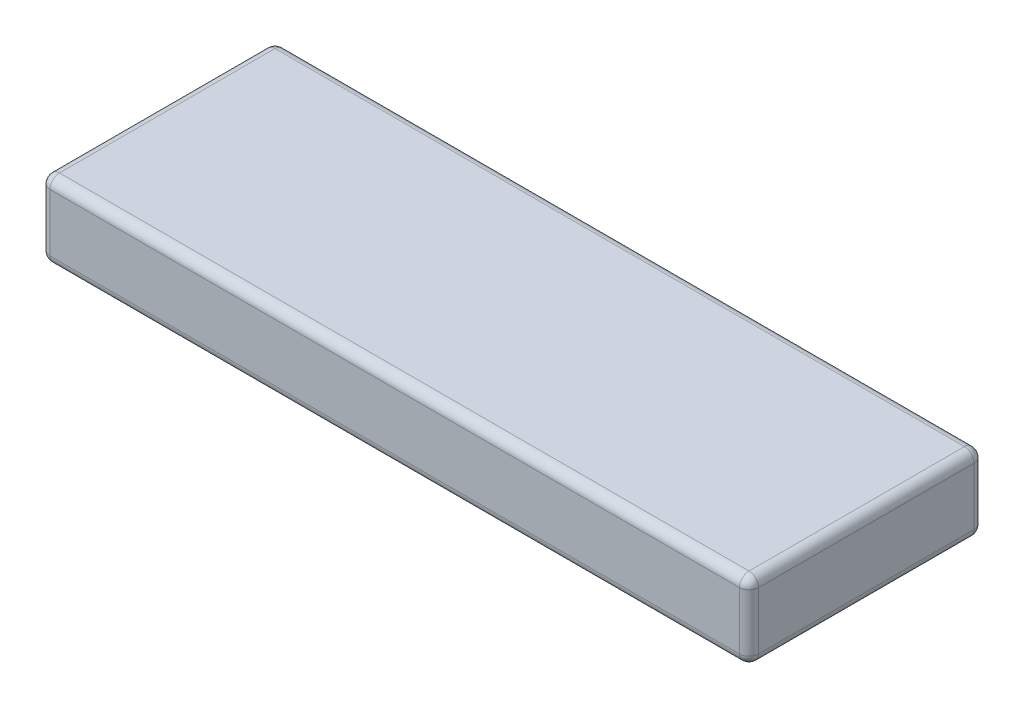
ISO-10303-21;
HEADER;
FILE_DESCRIPTION(('STEP AP214'),'2;1');
FILE_NAME('part.step','',(''),(''),'','','');
FILE_SCHEMA(('AUTOMOTIVE_DESIGN { 1 0 10303 214 1 1 1 1 }'));
ENDSEC;
DATA;
#1=APPLICATION_CONTEXT('core data for automotive mechanical design processes');
#2=APPLICATION_PROTOCOL_DEFINITION('international standard','automotive_design',2000,#1);
#3=PRODUCT_CONTEXT('',#1,'mechanical');
#4=PRODUCT('Part','Part','',(#3));
#5=PRODUCT_RELATED_PRODUCT_CATEGORY('part','',(#4));
#6=PRODUCT_DEFINITION_FORMATION('','',#4);
#7=PRODUCT_DEFINITION_CONTEXT('part definition',#1,'design');
#8=PRODUCT_DEFINITION('design','',#6,#7);
#9=PRODUCT_DEFINITION_SHAPE('','',#8);
#10=(LENGTH_UNIT() NAMED_UNIT(*) SI_UNIT(.MILLI.,.METRE.));
#11=(NAMED_UNIT(*) PLANE_ANGLE_UNIT() SI_UNIT($,.RADIAN.));
#12=(NAMED_UNIT(*) SI_UNIT($,.STERADIAN.) SOLID_ANGLE_UNIT());
#13=UNCERTAINTY_MEASURE_WITH_UNIT(LENGTH_MEASURE(1.E-05),#10,'distance_accuracy_value','');
#14=(GEOMETRIC_REPRESENTATION_CONTEXT(3) GLOBAL_UNCERTAINTY_ASSIGNED_CONTEXT((#13)) GLOBAL_UNIT_ASSIGNED_CONTEXT((#10,
#11,#12)) REPRESENTATION_CONTEXT('',''));
#15=CARTESIAN_POINT('',(0.,0.,0.));
#16=DIRECTION('',(0.,0.,1.));
#17=DIRECTION('',(1.,0.,0.));
#18=AXIS2_PLACEMENT_3D('',#15,#16,#17);
#19=CARTESIAN_POINT('',(-85.9648283794992,16.,-49.));
#20=DIRECTION('',(1.,0.,0.));
#21=DIRECTION('',(0.,0.,-1.));
#22=AXIS2_PLACEMENT_3D('',#19,#20,#21);
#23=PLANE('',#22);
#24=DIRECTION('',(0.,0.,1.));
#25=VECTOR('',#24,1.);
#26=CARTESIAN_POINT('',(-85.9648283794992,2.,-49.));
#27=LINE('',#26,#25);
#28=CARTESIAN_POINT('',(-85.9648283794992,2.,-47.));
#29=VERTEX_POINT('',#28);
#30=CARTESIAN_POINT('',(-85.9648283794992,2.,-2.));
#31=VERTEX_POINT('',#30);
#32=EDGE_CURVE('E282',#29,#31,#27,.T.);
#33=ORIENTED_EDGE('',*,*,#32,.T.);
#34=DIRECTION('',(0.,-1.,0.));
#35=VECTOR('',#34,1.);
#36=CARTESIAN_POINT('',(-85.9648283794992,16.,-2.));
#37=LINE('',#36,#35);
#38=CARTESIAN_POINT('',(-85.9648283794992,14.,-2.));
#39=VERTEX_POINT('',#38);
#40=EDGE_CURVE('E211',#31,#39,#37,.F.);
#41=ORIENTED_EDGE('',*,*,#40,.T.);
#42=DIRECTION('',(0.,0.,1.));
#43=VECTOR('',#42,1.);
#44=CARTESIAN_POINT('',(-85.9648283794992,14.,-49.));
#45=LINE('',#44,#43);
#46=CARTESIAN_POINT('',(-85.9648283794992,14.,-47.));
#47=VERTEX_POINT('',#46);
#48=EDGE_CURVE('E275',#39,#47,#45,.F.);
#49=ORIENTED_EDGE('',*,*,#48,.T.);
#50=DIRECTION('',(0.,-1.,0.));
#51=VECTOR('',#50,1.);
#52=CARTESIAN_POINT('',(-85.9648283794992,16.,-47.));
#53=LINE('',#52,#51);
#54=EDGE_CURVE('E277',#47,#29,#53,.T.);
#55=ORIENTED_EDGE('',*,*,#54,.T.);
#56=EDGE_LOOP('',(#33,#41,#49,#55));
#57=FACE_BOUND('',#56,.T.);
#58=ADVANCED_FACE('F33',(#57),#23,.F.);
#59=CARTESIAN_POINT('',(-85.9648283794992,16.,0.));
#60=DIRECTION('',(0.,0.,-1.));
#61=DIRECTION('',(-1.,0.,0.));
#62=AXIS2_PLACEMENT_3D('',#59,#60,#61);
#63=PLANE('',#62);
#64=DIRECTION('',(0.,-1.,0.));
#65=VECTOR('',#64,1.);
#66=CARTESIAN_POINT('',(-83.9648283794992,16.,0.));
#67=LINE('',#66,#65);
#68=CARTESIAN_POINT('',(-83.9648283794992,14.,0.));
#69=VERTEX_POINT('',#68);
#70=CARTESIAN_POINT('',(-83.9648283794992,2.,0.));
#71=VERTEX_POINT('',#70);
#72=EDGE_CURVE('E134',#69,#71,#67,.T.);
#73=ORIENTED_EDGE('',*,*,#72,.T.);
#74=DIRECTION('',(1.,0.,0.));
#75=VECTOR('',#74,1.);
#76=CARTESIAN_POINT('',(-85.9648283794992,2.,0.));
#77=LINE('',#76,#75);
#78=CARTESIAN_POINT('',(60.0351716205008,2.,0.));
#79=VERTEX_POINT('',#78);
#80=EDGE_CURVE('E130',#71,#79,#77,.T.);
#81=ORIENTED_EDGE('',*,*,#80,.T.);
#82=DIRECTION('',(0.,-1.,0.));
#83=VECTOR('',#82,1.);
#84=CARTESIAN_POINT('',(60.0351716205008,16.,0.));
#85=LINE('',#84,#83);
#86=CARTESIAN_POINT('',(60.0351716205008,14.,0.));
#87=VERTEX_POINT('',#86);
#88=EDGE_CURVE('E124',#79,#87,#85,.F.);
#89=ORIENTED_EDGE('',*,*,#88,.T.);
#90=DIRECTION('',(1.,0.,0.));
#91=VECTOR('',#90,1.);
#92=CARTESIAN_POINT('',(-85.9648283794992,14.,0.));
#93=LINE('',#92,#91);
#94=EDGE_CURVE('E127',#87,#69,#93,.F.);
#95=ORIENTED_EDGE('',*,*,#94,.T.);
#96=EDGE_LOOP('',(#73,#81,#89,#95));
#97=FACE_BOUND('',#96,.T.);
#98=ADVANCED_FACE('F126',(#97),#63,.F.);
#99=CARTESIAN_POINT('',(62.0351716205008,16.,0.));
#100=DIRECTION('',(-1.,0.,0.));
#101=DIRECTION('',(0.,0.,1.));
#102=AXIS2_PLACEMENT_3D('',#99,#100,#101);
#103=PLANE('',#102);
#104=DIRECTION('',(0.,0.,-1.));
#105=VECTOR('',#104,1.);
#106=CARTESIAN_POINT('',(62.0351716205008,2.,0.));
#107=LINE('',#106,#105);
#108=CARTESIAN_POINT('',(62.0351716205008,2.,-2.));
#109=VERTEX_POINT('',#108);
#110=CARTESIAN_POINT('',(62.0351716205008,2.,-47.));
#111=VERTEX_POINT('',#110);
#112=EDGE_CURVE('E228',#109,#111,#107,.T.);
#113=ORIENTED_EDGE('',*,*,#112,.T.);
#114=DIRECTION('',(0.,-1.,0.));
#115=VECTOR('',#114,1.);
#116=CARTESIAN_POINT('',(62.0351716205008,16.,-47.));
#117=LINE('',#116,#115);
#118=CARTESIAN_POINT('',(62.0351716205008,14.,-47.));
#119=VERTEX_POINT('',#118);
#120=EDGE_CURVE('E230',#111,#119,#117,.F.);
#121=ORIENTED_EDGE('',*,*,#120,.T.);
#122=DIRECTION('',(0.,0.,-1.));
#123=VECTOR('',#122,1.);
#124=CARTESIAN_POINT('',(62.0351716205008,14.,0.));
#125=LINE('',#124,#123);
#126=CARTESIAN_POINT('',(62.0351716205008,14.,-2.));
#127=VERTEX_POINT('',#126);
#128=EDGE_CURVE('E221',#119,#127,#125,.F.);
#129=ORIENTED_EDGE('',*,*,#128,.T.);
#130=DIRECTION('',(0.,-1.,0.));
#131=VECTOR('',#130,1.);
#132=CARTESIAN_POINT('',(62.0351716205008,16.,-2.));
#133=LINE('',#132,#131);
#134=EDGE_CURVE('E156',#127,#109,#133,.T.);
#135=ORIENTED_EDGE('',*,*,#134,.T.);
#136=EDGE_LOOP('',(#113,#121,#129,#135));
#137=FACE_BOUND('',#136,.T.);
#138=ADVANCED_FACE('F326',(#137),#103,.F.);
#139=CARTESIAN_POINT('',(62.0351716205008,16.,-49.));
#140=DIRECTION('',(0.,0.,1.));
#141=DIRECTION('',(1.,0.,0.));
#142=AXIS2_PLACEMENT_3D('',#139,#140,#141);
#143=PLANE('',#142);
#144=DIRECTION('',(-1.,0.,0.));
#145=VECTOR('',#144,1.);
#146=CARTESIAN_POINT('',(62.0351716205008,2.,-49.));
#147=LINE('',#146,#145);
#148=CARTESIAN_POINT('',(60.0351716205008,2.,-49.));
#149=VERTEX_POINT('',#148);
#150=CARTESIAN_POINT('',(-83.9648283794992,2.,-49.));
#151=VERTEX_POINT('',#150);
#152=EDGE_CURVE('E217',#149,#151,#147,.T.);
#153=ORIENTED_EDGE('',*,*,#152,.T.);
#154=DIRECTION('',(0.,-1.,0.));
#155=VECTOR('',#154,1.);
#156=CARTESIAN_POINT('',(-83.9648283794992,16.,-49.));
#157=LINE('',#156,#155);
#158=CARTESIAN_POINT('',(-83.9648283794992,14.,-49.));
#159=VERTEX_POINT('',#158);
#160=EDGE_CURVE('E214',#151,#159,#157,.F.);
#161=ORIENTED_EDGE('',*,*,#160,.T.);
#162=DIRECTION('',(-1.,0.,0.));
#163=VECTOR('',#162,1.);
#164=CARTESIAN_POINT('',(62.0351716205008,14.,-49.));
#165=LINE('',#164,#163);
#166=CARTESIAN_POINT('',(60.0351716205008,14.,-49.));
#167=VERTEX_POINT('',#166);
#168=EDGE_CURVE('E207',#159,#167,#165,.F.);
#169=ORIENTED_EDGE('',*,*,#168,.T.);
#170=DIRECTION('',(0.,-1.,0.));
#171=VECTOR('',#170,1.);
#172=CARTESIAN_POINT('',(60.0351716205008,16.,-49.));
#173=LINE('',#172,#171);
#174=EDGE_CURVE('E210',#167,#149,#173,.T.);
#175=ORIENTED_EDGE('',*,*,#174,.T.);
#176=EDGE_LOOP('',(#153,#161,#169,#175));
#177=FACE_BOUND('',#176,.T.);
#178=ADVANCED_FACE('F215',(#177),#143,.F.);
#179=CARTESIAN_POINT('',(-85.9648283794992,16.,0.));
#180=DIRECTION('',(0.,1.,0.));
#181=DIRECTION('',(0.,0.,1.));
#182=AXIS2_PLACEMENT_3D('',#179,#180,#181);
#183=PLANE('',#182);
#184=DIRECTION('',(1.,0.,0.));
#185=VECTOR('',#184,1.);
#186=CARTESIAN_POINT('',(62.0351716205008,16.,-2.));
#187=LINE('',#186,#185);
#188=CARTESIAN_POINT('',(-83.9648283794992,16.,-2.));
#189=VERTEX_POINT('',#188);
#190=CARTESIAN_POINT('',(60.0351716205008,16.,-2.));
#191=VERTEX_POINT('',#190);
#192=EDGE_CURVE('E233',#189,#191,#187,.T.);
#193=ORIENTED_EDGE('',*,*,#192,.T.);
#194=DIRECTION('',(0.,0.,-1.));
#195=VECTOR('',#194,1.);
#196=CARTESIAN_POINT('',(60.0351716205008,16.,-49.));
#197=LINE('',#196,#195);
#198=CARTESIAN_POINT('',(60.0351716205008,16.,-47.));
#199=VERTEX_POINT('',#198);
#200=EDGE_CURVE('E11',#191,#199,#197,.T.);
#201=ORIENTED_EDGE('',*,*,#200,.T.);
#202=DIRECTION('',(-1.,0.,0.));
#203=VECTOR('',#202,1.);
#204=CARTESIAN_POINT('',(-85.9648283794992,16.,-47.));
#205=LINE('',#204,#203);
#206=CARTESIAN_POINT('',(-83.9648283794992,16.,-47.));
#207=VERTEX_POINT('',#206);
#208=EDGE_CURVE('E42',#199,#207,#205,.T.);
#209=ORIENTED_EDGE('',*,*,#208,.T.);
#210=DIRECTION('',(0.,0.,1.));
#211=VECTOR('',#210,1.);
#212=CARTESIAN_POINT('',(-83.9648283794992,16.,0.));
#213=LINE('',#212,#211);
#214=EDGE_CURVE('E235',#207,#189,#213,.T.);
#215=ORIENTED_EDGE('',*,*,#214,.T.);
#216=EDGE_LOOP('',(#193,#201,#209,#215));
#217=FACE_BOUND('',#216,.T.);
#218=ADVANCED_FACE('F483',(#217),#183,.T.);
#219=CARTESIAN_POINT('',(-85.9648283794992,0.,0.));
#220=DIRECTION('',(0.,1.,0.));
#221=DIRECTION('',(0.,0.,1.));
#222=AXIS2_PLACEMENT_3D('',#219,#220,#221);
#223=PLANE('',#222);
#224=DIRECTION('',(0.,0.,-1.));
#225=VECTOR('',#224,1.);
#226=CARTESIAN_POINT('',(60.0351716205008,0.,0.));
#227=LINE('',#226,#225);
#228=CARTESIAN_POINT('',(60.0351716205008,0.,-47.));
#229=VERTEX_POINT('',#228);
#230=CARTESIAN_POINT('',(60.0351716205008,0.,-2.));
#231=VERTEX_POINT('',#230);
#232=EDGE_CURVE('E271',#229,#231,#227,.F.);
#233=ORIENTED_EDGE('',*,*,#232,.T.);
#234=DIRECTION('',(1.,0.,0.));
#235=VECTOR('',#234,1.);
#236=CARTESIAN_POINT('',(-85.9648283794992,0.,-2.));
#237=LINE('',#236,#235);
#238=CARTESIAN_POINT('',(-83.9648283794992,0.,-2.));
#239=VERTEX_POINT('',#238);
#240=EDGE_CURVE('E265',#231,#239,#237,.F.);
#241=ORIENTED_EDGE('',*,*,#240,.T.);
#242=DIRECTION('',(0.,0.,1.));
#243=VECTOR('',#242,1.);
#244=CARTESIAN_POINT('',(-83.9648283794992,0.,0.));
#245=LINE('',#244,#243);
#246=CARTESIAN_POINT('',(-83.9648283794992,0.,-47.));
#247=VERTEX_POINT('',#246);
#248=EDGE_CURVE('E259',#239,#247,#245,.F.);
#249=ORIENTED_EDGE('',*,*,#248,.T.);
#250=DIRECTION('',(-1.,0.,0.));
#251=VECTOR('',#250,1.);
#252=CARTESIAN_POINT('',(-85.9648283794992,0.,-47.));
#253=LINE('',#252,#251);
#254=EDGE_CURVE('E266',#247,#229,#253,.F.);
#255=ORIENTED_EDGE('',*,*,#254,.T.);
#256=EDGE_LOOP('',(#233,#241,#249,#255));
#257=FACE_BOUND('',#256,.T.);
#258=ADVANCED_FACE('F269',(#257),#223,.F.);
#259=CARTESIAN_POINT('',(-85.9648283794992,14.,-47.));
#260=DIRECTION('',(1.,0.,0.));
#261=DIRECTION('',(0.,0.,-1.));
#262=AXIS2_PLACEMENT_3D('',#259,#260,#261);
#263=CYLINDRICAL_SURFACE('',#262,2.);
#264=CARTESIAN_POINT('',(-83.9648283794992,14.,-47.));
#265=DIRECTION('',(-1.,0.,0.));
#266=DIRECTION('',(0.,0.,1.));
#267=AXIS2_PLACEMENT_3D('',#264,#265,#266);
#268=CIRCLE('',#267,2.);
#269=EDGE_CURVE('E37',#207,#159,#268,.T.);
#270=ORIENTED_EDGE('',*,*,#269,.F.);
#271=ORIENTED_EDGE('',*,*,#208,.F.);
#272=CARTESIAN_POINT('',(60.0351716205008,14.,-47.));
#273=DIRECTION('',(1.,0.,0.));
#274=DIRECTION('',(0.,0.,-1.));
#275=AXIS2_PLACEMENT_3D('',#272,#273,#274);
#276=CIRCLE('',#275,2.);
#277=EDGE_CURVE('E194',#167,#199,#276,.T.);
#278=ORIENTED_EDGE('',*,*,#277,.F.);
#279=ORIENTED_EDGE('',*,*,#168,.F.);
#280=EDGE_LOOP('',(#270,#271,#278,#279));
#281=FACE_BOUND('',#280,.T.);
#282=ADVANCED_FACE('F35',(#281),#263,.T.);
#283=CARTESIAN_POINT('',(-83.9648283794992,14.,-47.));
#284=DIRECTION('',(0.,0.,1.));
#285=DIRECTION('',(1.,0.,0.));
#286=AXIS2_PLACEMENT_3D('',#283,#284,#285);
#287=SPHERICAL_SURFACE('',#286,2.);
#288=CARTESIAN_POINT('',(-83.9648283794992,14.,-47.));
#289=DIRECTION('',(0.,0.,-1.));
#290=DIRECTION('',(-1.,0.,0.));
#291=AXIS2_PLACEMENT_3D('',#288,#289,#290);
#292=CIRCLE('',#291,2.);
#293=EDGE_CURVE('E190',#207,#47,#292,.F.);
#294=ORIENTED_EDGE('',*,*,#293,.F.);
#295=ORIENTED_EDGE('',*,*,#269,.T.);
#296=CARTESIAN_POINT('',(-83.9648283794992,14.,-47.));
#297=DIRECTION('',(0.,1.,0.));
#298=DIRECTION('',(0.,0.,1.));
#299=AXIS2_PLACEMENT_3D('',#296,#297,#298);
#300=CIRCLE('',#299,2.);
#301=EDGE_CURVE('E193',#47,#159,#300,.F.);
#302=ORIENTED_EDGE('',*,*,#301,.F.);
#303=EDGE_LOOP('',(#294,#295,#302));
#304=FACE_BOUND('',#303,.T.);
#305=ADVANCED_FACE('F203',(#304),#287,.T.);
#306=CARTESIAN_POINT('',(60.0351716205008,14.,-47.));
#307=DIRECTION('',(0.,0.,1.));
#308=DIRECTION('',(1.,0.,0.));
#309=AXIS2_PLACEMENT_3D('',#306,#307,#308);
#310=SPHERICAL_SURFACE('',#309,2.);
#311=CARTESIAN_POINT('',(60.0351716205008,14.,-47.));
#312=DIRECTION('',(0.,1.,0.));
#313=DIRECTION('',(0.,0.,1.));
#314=AXIS2_PLACEMENT_3D('',#311,#312,#313);
#315=CIRCLE('',#314,2.);
#316=EDGE_CURVE('E186',#167,#119,#315,.F.);
#317=ORIENTED_EDGE('',*,*,#316,.F.);
#318=ORIENTED_EDGE('',*,*,#277,.T.);
#319=CARTESIAN_POINT('',(60.0351716205008,14.,-47.));
#320=DIRECTION('',(0.,0.,-1.));
#321=DIRECTION('',(-1.,0.,0.));
#322=AXIS2_PLACEMENT_3D('',#319,#320,#321);
#323=CIRCLE('',#322,2.);
#324=EDGE_CURVE('E50',#119,#199,#323,.F.);
#325=ORIENTED_EDGE('',*,*,#324,.F.);
#326=EDGE_LOOP('',(#317,#318,#325));
#327=FACE_BOUND('',#326,.T.);
#328=ADVANCED_FACE('F456',(#327),#310,.T.);
#329=CARTESIAN_POINT('',(-83.9648283794992,16.,-47.));
#330=DIRECTION('',(0.,-1.,0.));
#331=DIRECTION('',(0.,0.,-1.));
#332=AXIS2_PLACEMENT_3D('',#329,#330,#331);
#333=CYLINDRICAL_SURFACE('',#332,2.);
#334=ORIENTED_EDGE('',*,*,#301,.T.);
#335=ORIENTED_EDGE('',*,*,#160,.F.);
#336=CARTESIAN_POINT('',(-83.9648283794992,2.,-47.));
#337=DIRECTION('',(0.,-1.,0.));
#338=DIRECTION('',(0.,0.,-1.));
#339=AXIS2_PLACEMENT_3D('',#336,#337,#338);
#340=CIRCLE('',#339,2.);
#341=EDGE_CURVE('E180',#29,#151,#340,.T.);
#342=ORIENTED_EDGE('',*,*,#341,.F.);
#343=ORIENTED_EDGE('',*,*,#54,.F.);
#344=EDGE_LOOP('',(#334,#335,#342,#343));
#345=FACE_BOUND('',#344,.T.);
#346=ADVANCED_FACE('F308',(#345),#333,.T.);
#347=CARTESIAN_POINT('',(-83.9648283794992,14.,0.));
#348=DIRECTION('',(0.,0.,-1.));
#349=DIRECTION('',(-1.,0.,0.));
#350=AXIS2_PLACEMENT_3D('',#347,#348,#349);
#351=CYLINDRICAL_SURFACE('',#350,2.);
#352=ORIENTED_EDGE('',*,*,#293,.T.);
#353=ORIENTED_EDGE('',*,*,#48,.F.);
#354=CARTESIAN_POINT('',(-83.9648283794992,14.,-2.));
#355=DIRECTION('',(0.,0.,1.));
#356=DIRECTION('',(1.,0.,0.));
#357=AXIS2_PLACEMENT_3D('',#354,#355,#356);
#358=CIRCLE('',#357,2.);
#359=EDGE_CURVE('E177',#189,#39,#358,.T.);
#360=ORIENTED_EDGE('',*,*,#359,.F.);
#361=ORIENTED_EDGE('',*,*,#214,.F.);
#362=EDGE_LOOP('',(#352,#353,#360,#361));
#363=FACE_BOUND('',#362,.T.);
#364=ADVANCED_FACE('F440',(#363),#351,.T.);
#365=CARTESIAN_POINT('',(-85.9648283794992,14.,-2.));
#366=DIRECTION('',(-1.,0.,0.));
#367=DIRECTION('',(0.,0.,1.));
#368=AXIS2_PLACEMENT_3D('',#365,#366,#367);
#369=CYLINDRICAL_SURFACE('',#368,2.);
#370=CARTESIAN_POINT('',(60.0351716205008,14.,-2.));
#371=DIRECTION('',(1.,0.,0.));
#372=DIRECTION('',(0.,0.,-1.));
#373=AXIS2_PLACEMENT_3D('',#370,#371,#372);
#374=CIRCLE('',#373,2.);
#375=EDGE_CURVE('E141',#191,#87,#374,.T.);
#376=ORIENTED_EDGE('',*,*,#375,.F.);
#377=ORIENTED_EDGE('',*,*,#192,.F.);
#378=CARTESIAN_POINT('',(-83.9648283794992,14.,-2.));
#379=DIRECTION('',(-1.,0.,0.));
#380=DIRECTION('',(0.,0.,1.));
#381=AXIS2_PLACEMENT_3D('',#378,#379,#380);
#382=CIRCLE('',#381,2.);
#383=EDGE_CURVE('E144',#69,#189,#382,.T.);
#384=ORIENTED_EDGE('',*,*,#383,.F.);
#385=ORIENTED_EDGE('',*,*,#94,.F.);
#386=EDGE_LOOP('',(#376,#377,#384,#385));
#387=FACE_BOUND('',#386,.T.);
#388=ADVANCED_FACE('F139',(#387),#369,.T.);
#389=CARTESIAN_POINT('',(60.0351716205008,14.,0.));
#390=DIRECTION('',(0.,0.,1.));
#391=DIRECTION('',(1.,0.,0.));
#392=AXIS2_PLACEMENT_3D('',#389,#390,#391);
#393=CYLINDRICAL_SURFACE('',#392,2.);
#394=ORIENTED_EDGE('',*,*,#324,.T.);
#395=ORIENTED_EDGE('',*,*,#200,.F.);
#396=CARTESIAN_POINT('',(60.0351716205008,14.,-2.));
#397=DIRECTION('',(0.,0.,1.));
#398=DIRECTION('',(1.,0.,0.));
#399=AXIS2_PLACEMENT_3D('',#396,#397,#398);
#400=CIRCLE('',#399,2.);
#401=EDGE_CURVE('E153',#127,#191,#400,.T.);
#402=ORIENTED_EDGE('',*,*,#401,.F.);
#403=ORIENTED_EDGE('',*,*,#128,.F.);
#404=EDGE_LOOP('',(#394,#395,#402,#403));
#405=FACE_BOUND('',#404,.T.);
#406=ADVANCED_FACE('F425',(#405),#393,.T.);
#407=CARTESIAN_POINT('',(60.0351716205008,16.,-47.));
#408=DIRECTION('',(0.,-1.,0.));
#409=DIRECTION('',(0.,0.,-1.));
#410=AXIS2_PLACEMENT_3D('',#407,#408,#409);
#411=CYLINDRICAL_SURFACE('',#410,2.);
#412=ORIENTED_EDGE('',*,*,#316,.T.);
#413=ORIENTED_EDGE('',*,*,#120,.F.);
#414=CARTESIAN_POINT('',(60.0351716205008,2.,-47.));
#415=DIRECTION('',(0.,-1.,0.));
#416=DIRECTION('',(0.,0.,-1.));
#417=AXIS2_PLACEMENT_3D('',#414,#415,#416);
#418=CIRCLE('',#417,2.);
#419=EDGE_CURVE('E172',#149,#111,#418,.T.);
#420=ORIENTED_EDGE('',*,*,#419,.F.);
#421=ORIENTED_EDGE('',*,*,#174,.F.);
#422=EDGE_LOOP('',(#412,#413,#420,#421));
#423=FACE_BOUND('',#422,.T.);
#424=ADVANCED_FACE('F293',(#423),#411,.T.);
#425=CARTESIAN_POINT('',(62.0351716205008,2.,-47.));
#426=DIRECTION('',(-1.,0.,0.));
#427=DIRECTION('',(0.,0.,1.));
#428=AXIS2_PLACEMENT_3D('',#425,#426,#427);
#429=CYLINDRICAL_SURFACE('',#428,2.);
#430=CARTESIAN_POINT('',(-83.9648283794992,2.,-47.));
#431=DIRECTION('',(-1.,0.,0.));
#432=DIRECTION('',(0.,0.,1.));
#433=AXIS2_PLACEMENT_3D('',#430,#431,#432);
#434=CIRCLE('',#433,2.);
#435=EDGE_CURVE('E183',#151,#247,#434,.T.);
#436=ORIENTED_EDGE('',*,*,#435,.F.);
#437=ORIENTED_EDGE('',*,*,#152,.F.);
#438=CARTESIAN_POINT('',(60.0351716205008,2.,-47.));
#439=DIRECTION('',(1.,0.,0.));
#440=DIRECTION('',(0.,0.,-1.));
#441=AXIS2_PLACEMENT_3D('',#438,#439,#440);
#442=CIRCLE('',#441,2.);
#443=EDGE_CURVE('E169',#229,#149,#442,.T.);
#444=ORIENTED_EDGE('',*,*,#443,.F.);
#445=ORIENTED_EDGE('',*,*,#254,.F.);
#446=EDGE_LOOP('',(#436,#437,#444,#445));
#447=FACE_BOUND('',#446,.T.);
#448=ADVANCED_FACE('F290',(#447),#429,.T.);
#449=CARTESIAN_POINT('',(-83.9648283794992,2.,-47.));
#450=DIRECTION('',(0.,0.,1.));
#451=DIRECTION('',(1.,0.,0.));
#452=AXIS2_PLACEMENT_3D('',#449,#450,#451);
#453=SPHERICAL_SURFACE('',#452,2.);
#454=ORIENTED_EDGE('',*,*,#341,.T.);
#455=ORIENTED_EDGE('',*,*,#435,.T.);
#456=CARTESIAN_POINT('',(-83.9648283794992,2.,-47.));
#457=DIRECTION('',(0.,0.,-1.));
#458=DIRECTION('',(-1.,0.,0.));
#459=AXIS2_PLACEMENT_3D('',#456,#457,#458);
#460=CIRCLE('',#459,2.);
#461=EDGE_CURVE('E160',#29,#247,#460,.F.);
#462=ORIENTED_EDGE('',*,*,#461,.F.);
#463=EDGE_LOOP('',(#454,#455,#462));
#464=FACE_BOUND('',#463,.T.);
#465=ADVANCED_FACE('F310',(#464),#453,.T.);
#466=CARTESIAN_POINT('',(-83.9648283794992,14.,-2.));
#467=DIRECTION('',(0.,0.,1.));
#468=DIRECTION('',(1.,0.,0.));
#469=AXIS2_PLACEMENT_3D('',#466,#467,#468);
#470=SPHERICAL_SURFACE('',#469,2.);
#471=ORIENTED_EDGE('',*,*,#383,.T.);
#472=ORIENTED_EDGE('',*,*,#359,.T.);
#473=CARTESIAN_POINT('',(-83.9648283794992,14.,-2.));
#474=DIRECTION('',(0.,1.,0.));
#475=DIRECTION('',(0.,0.,1.));
#476=AXIS2_PLACEMENT_3D('',#473,#474,#475);
#477=CIRCLE('',#476,2.);
#478=EDGE_CURVE('E157',#69,#39,#477,.F.);
#479=ORIENTED_EDGE('',*,*,#478,.F.);
#480=EDGE_LOOP('',(#471,#472,#479));
#481=FACE_BOUND('',#480,.T.);
#482=ADVANCED_FACE('F312',(#481),#470,.T.);
#483=CARTESIAN_POINT('',(60.0351716205008,14.,-2.));
#484=DIRECTION('',(0.,0.,1.));
#485=DIRECTION('',(1.,0.,0.));
#486=AXIS2_PLACEMENT_3D('',#483,#484,#485);
#487=SPHERICAL_SURFACE('',#486,2.);
#488=ORIENTED_EDGE('',*,*,#401,.T.);
#489=ORIENTED_EDGE('',*,*,#375,.T.);
#490=CARTESIAN_POINT('',(60.0351716205008,14.,-2.));
#491=DIRECTION('',(0.,1.,0.));
#492=DIRECTION('',(0.,0.,1.));
#493=AXIS2_PLACEMENT_3D('',#490,#491,#492);
#494=CIRCLE('',#493,2.);
#495=EDGE_CURVE('E150',#127,#87,#494,.F.);
#496=ORIENTED_EDGE('',*,*,#495,.F.);
#497=EDGE_LOOP('',(#488,#489,#496));
#498=FACE_BOUND('',#497,.T.);
#499=ADVANCED_FACE('F149',(#498),#487,.T.);
#500=CARTESIAN_POINT('',(60.0351716205008,2.,-47.));
#501=DIRECTION('',(0.,0.,1.));
#502=DIRECTION('',(1.,0.,0.));
#503=AXIS2_PLACEMENT_3D('',#500,#501,#502);
#504=SPHERICAL_SURFACE('',#503,2.);
#505=ORIENTED_EDGE('',*,*,#443,.T.);
#506=ORIENTED_EDGE('',*,*,#419,.T.);
#507=CARTESIAN_POINT('',(60.0351716205008,2.,-47.));
#508=DIRECTION('',(0.,0.,-1.));
#509=DIRECTION('',(-1.,0.,0.));
#510=AXIS2_PLACEMENT_3D('',#507,#508,#509);
#511=CIRCLE('',#510,2.);
#512=EDGE_CURVE('E158',#229,#111,#511,.F.);
#513=ORIENTED_EDGE('',*,*,#512,.F.);
#514=EDGE_LOOP('',(#505,#506,#513));
#515=FACE_BOUND('',#514,.T.);
#516=ADVANCED_FACE('F295',(#515),#504,.T.);
#517=CARTESIAN_POINT('',(-83.9648283794992,2.,-49.));
#518=DIRECTION('',(0.,0.,1.));
#519=DIRECTION('',(1.,0.,0.));
#520=AXIS2_PLACEMENT_3D('',#517,#518,#519);
#521=CYLINDRICAL_SURFACE('',#520,2.);
#522=ORIENTED_EDGE('',*,*,#461,.T.);
#523=ORIENTED_EDGE('',*,*,#248,.F.);
#524=CARTESIAN_POINT('',(-83.9648283794992,2.,-2.));
#525=DIRECTION('',(0.,0.,1.));
#526=DIRECTION('',(1.,0.,0.));
#527=AXIS2_PLACEMENT_3D('',#524,#525,#526);
#528=CIRCLE('',#527,2.);
#529=EDGE_CURVE('E163',#31,#239,#528,.T.);
#530=ORIENTED_EDGE('',*,*,#529,.F.);
#531=ORIENTED_EDGE('',*,*,#32,.F.);
#532=EDGE_LOOP('',(#522,#523,#530,#531));
#533=FACE_BOUND('',#532,.T.);
#534=ADVANCED_FACE('F261',(#533),#521,.T.);
#535=CARTESIAN_POINT('',(-83.9648283794992,16.,-2.));
#536=DIRECTION('',(0.,-1.,0.));
#537=DIRECTION('',(0.,0.,-1.));
#538=AXIS2_PLACEMENT_3D('',#535,#536,#537);
#539=CYLINDRICAL_SURFACE('',#538,2.);
#540=ORIENTED_EDGE('',*,*,#478,.T.);
#541=ORIENTED_EDGE('',*,*,#40,.F.);
#542=CARTESIAN_POINT('',(-83.9648283794992,2.,-2.));
#543=DIRECTION('',(0.,-1.,0.));
#544=DIRECTION('',(0.,0.,-1.));
#545=AXIS2_PLACEMENT_3D('',#542,#543,#544);
#546=CIRCLE('',#545,2.);
#547=EDGE_CURVE('E248',#71,#31,#546,.T.);
#548=ORIENTED_EDGE('',*,*,#547,.F.);
#549=ORIENTED_EDGE('',*,*,#72,.F.);
#550=EDGE_LOOP('',(#540,#541,#548,#549));
#551=FACE_BOUND('',#550,.T.);
#552=ADVANCED_FACE('F305',(#551),#539,.T.);
#553=CARTESIAN_POINT('',(60.0351716205008,16.,-2.));
#554=DIRECTION('',(0.,-1.,0.));
#555=DIRECTION('',(0.,0.,-1.));
#556=AXIS2_PLACEMENT_3D('',#553,#554,#555);
#557=CYLINDRICAL_SURFACE('',#556,2.);
#558=ORIENTED_EDGE('',*,*,#495,.T.);
#559=ORIENTED_EDGE('',*,*,#88,.F.);
#560=CARTESIAN_POINT('',(60.0351716205008,2.,-2.));
#561=DIRECTION('',(0.,-1.,0.));
#562=DIRECTION('',(0.,0.,-1.));
#563=AXIS2_PLACEMENT_3D('',#560,#561,#562);
#564=CIRCLE('',#563,2.);
#565=EDGE_CURVE('E245',#109,#79,#564,.T.);
#566=ORIENTED_EDGE('',*,*,#565,.F.);
#567=ORIENTED_EDGE('',*,*,#134,.F.);
#568=EDGE_LOOP('',(#558,#559,#566,#567));
#569=FACE_BOUND('',#568,.T.);
#570=ADVANCED_FACE('F155',(#569),#557,.T.);
#571=CARTESIAN_POINT('',(60.0351716205008,2.,0.));
#572=DIRECTION('',(0.,0.,-1.));
#573=DIRECTION('',(-1.,0.,0.));
#574=AXIS2_PLACEMENT_3D('',#571,#572,#573);
#575=CYLINDRICAL_SURFACE('',#574,2.);
#576=ORIENTED_EDGE('',*,*,#512,.T.);
#577=ORIENTED_EDGE('',*,*,#112,.F.);
#578=CARTESIAN_POINT('',(60.0351716205008,2.,-2.));
#579=DIRECTION('',(0.,0.,1.));
#580=DIRECTION('',(1.,0.,0.));
#581=AXIS2_PLACEMENT_3D('',#578,#579,#580);
#582=CIRCLE('',#581,2.);
#583=EDGE_CURVE('E242',#231,#109,#582,.T.);
#584=ORIENTED_EDGE('',*,*,#583,.F.);
#585=ORIENTED_EDGE('',*,*,#232,.F.);
#586=EDGE_LOOP('',(#576,#577,#584,#585));
#587=FACE_BOUND('',#586,.T.);
#588=ADVANCED_FACE('F298',(#587),#575,.T.);
#589=CARTESIAN_POINT('',(-83.9648283794992,2.,-2.));
#590=DIRECTION('',(0.,0.,1.));
#591=DIRECTION('',(1.,0.,0.));
#592=AXIS2_PLACEMENT_3D('',#589,#590,#591);
#593=SPHERICAL_SURFACE('',#592,2.);
#594=ORIENTED_EDGE('',*,*,#547,.T.);
#595=ORIENTED_EDGE('',*,*,#529,.T.);
#596=CARTESIAN_POINT('',(-83.9648283794992,2.,-2.));
#597=DIRECTION('',(-1.,0.,0.));
#598=DIRECTION('',(0.,0.,1.));
#599=AXIS2_PLACEMENT_3D('',#596,#597,#598);
#600=CIRCLE('',#599,2.);
#601=EDGE_CURVE('E240',#71,#239,#600,.F.);
#602=ORIENTED_EDGE('',*,*,#601,.F.);
#603=EDGE_LOOP('',(#594,#595,#602));
#604=FACE_BOUND('',#603,.T.);
#605=ADVANCED_FACE('F255',(#604),#593,.T.);
#606=CARTESIAN_POINT('',(60.0351716205008,2.,-2.));
#607=DIRECTION('',(0.,0.,1.));
#608=DIRECTION('',(1.,0.,0.));
#609=AXIS2_PLACEMENT_3D('',#606,#607,#608);
#610=SPHERICAL_SURFACE('',#609,2.);
#611=ORIENTED_EDGE('',*,*,#583,.T.);
#612=ORIENTED_EDGE('',*,*,#565,.T.);
#613=CARTESIAN_POINT('',(60.0351716205008,2.,-2.));
#614=DIRECTION('',(1.,0.,0.));
#615=DIRECTION('',(0.,0.,-1.));
#616=AXIS2_PLACEMENT_3D('',#613,#614,#615);
#617=CIRCLE('',#616,2.);
#618=EDGE_CURVE('E238',#231,#79,#617,.F.);
#619=ORIENTED_EDGE('',*,*,#618,.F.);
#620=EDGE_LOOP('',(#611,#612,#619));
#621=FACE_BOUND('',#620,.T.);
#622=ADVANCED_FACE('F333',(#621),#610,.T.);
#623=CARTESIAN_POINT('',(-85.9648283794992,2.,-2.));
#624=DIRECTION('',(1.,0.,0.));
#625=DIRECTION('',(0.,0.,-1.));
#626=AXIS2_PLACEMENT_3D('',#623,#624,#625);
#627=CYLINDRICAL_SURFACE('',#626,2.);
#628=ORIENTED_EDGE('',*,*,#601,.T.);
#629=ORIENTED_EDGE('',*,*,#240,.F.);
#630=ORIENTED_EDGE('',*,*,#618,.T.);
#631=ORIENTED_EDGE('',*,*,#80,.F.);
#632=EDGE_LOOP('',(#628,#629,#630,#631));
#633=FACE_BOUND('',#632,.T.);
#634=ADVANCED_FACE('F330',(#633),#627,.T.);
#635=CLOSED_SHELL('',(#58,#98,#138,#178,#218,#258,#282,#305,#328,#346,#364,#388,#406,#424,#448,
#465,#482,#499,#516,#534,#552,#570,#588,#605,#622,#634));
#636=MANIFOLD_SOLID_BREP('B2',#635);
#637=ADVANCED_BREP_SHAPE_REPRESENTATION('',(#18,#636),#14);
#638=SHAPE_DEFINITION_REPRESENTATION(#9,#637);
ENDSEC;
END-ISO-10303-21;
